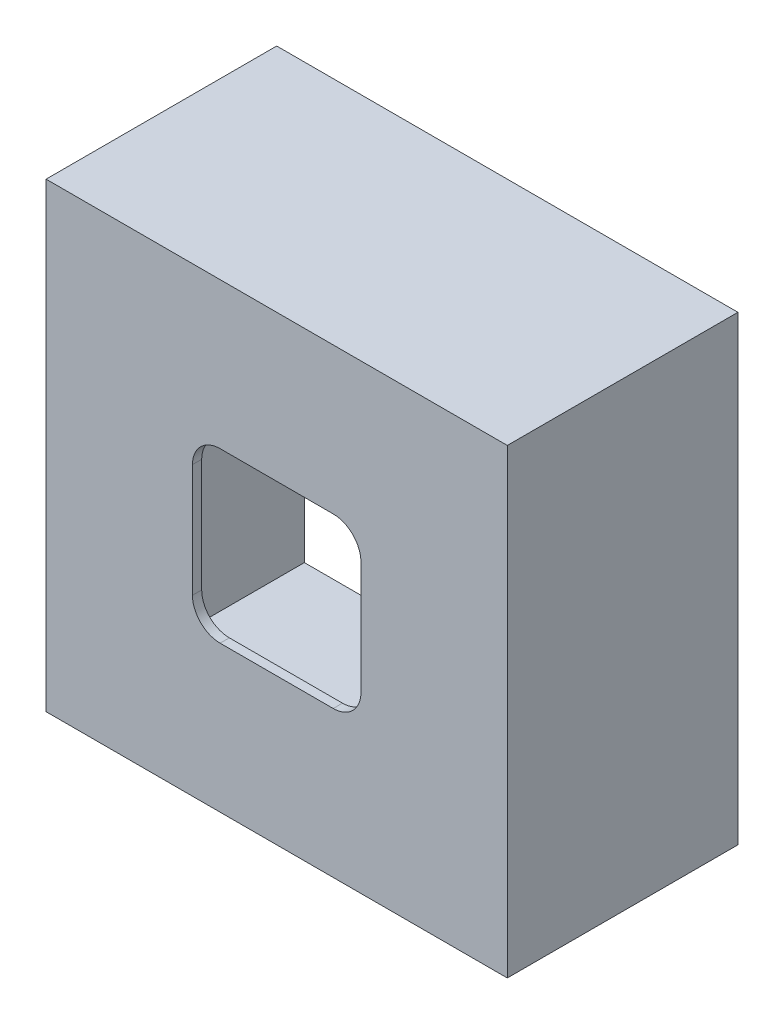
ISO-10303-21;
HEADER;
FILE_DESCRIPTION(('STEP AP214'),'2;1');
FILE_NAME('part.step','',(''),(''),'','','');
FILE_SCHEMA(('AUTOMOTIVE_DESIGN { 1 0 10303 214 1 1 1 1 }'));
ENDSEC;
DATA;
#1=APPLICATION_CONTEXT('core data for automotive mechanical design processes');
#2=APPLICATION_PROTOCOL_DEFINITION('international standard','automotive_design',2000,#1);
#3=PRODUCT_CONTEXT('',#1,'mechanical');
#4=PRODUCT('Part','Part','',(#3));
#5=PRODUCT_RELATED_PRODUCT_CATEGORY('part','',(#4));
#6=PRODUCT_DEFINITION_FORMATION('','',#4);
#7=PRODUCT_DEFINITION_CONTEXT('part definition',#1,'design');
#8=PRODUCT_DEFINITION('design','',#6,#7);
#9=PRODUCT_DEFINITION_SHAPE('','',#8);
#10=(LENGTH_UNIT() NAMED_UNIT(*) SI_UNIT(.MILLI.,.METRE.));
#11=(NAMED_UNIT(*) PLANE_ANGLE_UNIT() SI_UNIT($,.RADIAN.));
#12=(NAMED_UNIT(*) SI_UNIT($,.STERADIAN.) SOLID_ANGLE_UNIT());
#13=UNCERTAINTY_MEASURE_WITH_UNIT(LENGTH_MEASURE(1.E-05),#10,'distance_accuracy_value','');
#14=(GEOMETRIC_REPRESENTATION_CONTEXT(3) GLOBAL_UNCERTAINTY_ASSIGNED_CONTEXT((#13)) GLOBAL_UNIT_ASSIGNED_CONTEXT((#10,
#11,#12)) REPRESENTATION_CONTEXT('',''));
#15=CARTESIAN_POINT('',(0.,0.,0.));
#16=DIRECTION('',(0.,0.,1.));
#17=DIRECTION('',(1.,0.,0.));
#18=AXIS2_PLACEMENT_3D('',#15,#16,#17);
#19=CARTESIAN_POINT('',(50.,-50.0000000000001,-143.42135623731));
#20=DIRECTION('',(0.,-1.,0.));
#21=DIRECTION('',(0.,0.,-1.));
#22=AXIS2_PLACEMENT_3D('',#19,#20,#21);
#23=PLANE('',#22);
#24=DIRECTION('',(0.,0.,1.));
#25=VECTOR('',#24,1.);
#26=CARTESIAN_POINT('',(-50.,-50.0000000000001,-143.42135623731));
#27=LINE('',#26,#25);
#28=CARTESIAN_POINT('',(-50.,-50.0000000000001,-50.));
#29=VERTEX_POINT('',#28);
#30=CARTESIAN_POINT('',(-50.,-50.0000000000001,0.));
#31=VERTEX_POINT('',#30);
#32=EDGE_CURVE('E269',#29,#31,#27,.T.);
#33=ORIENTED_EDGE('',*,*,#32,.F.);
#34=DIRECTION('',(-1.,0.,0.));
#35=VECTOR('',#34,1.);
#36=CARTESIAN_POINT('',(50.,-50.,-50.));
#37=LINE('',#36,#35);
#38=CARTESIAN_POINT('',(50.,-50.,-50.));
#39=VERTEX_POINT('',#38);
#40=EDGE_CURVE('E191',#39,#29,#37,.T.);
#41=ORIENTED_EDGE('',*,*,#40,.F.);
#42=DIRECTION('',(0.,0.,1.));
#43=VECTOR('',#42,1.);
#44=CARTESIAN_POINT('',(50.,-50.0000000000001,-143.42135623731));
#45=LINE('',#44,#43);
#46=CARTESIAN_POINT('',(50.,-50.0000000000001,0.));
#47=VERTEX_POINT('',#46);
#48=EDGE_CURVE('E274',#39,#47,#45,.T.);
#49=ORIENTED_EDGE('',*,*,#48,.T.);
#50=DIRECTION('',(1.,0.,0.));
#51=VECTOR('',#50,1.);
#52=CARTESIAN_POINT('',(50.,-50.0000000000001,0.));
#53=LINE('',#52,#51);
#54=EDGE_CURVE('E260',#31,#47,#53,.T.);
#55=ORIENTED_EDGE('',*,*,#54,.F.);
#56=EDGE_LOOP('',(#33,#41,#49,#55));
#57=FACE_BOUND('',#56,.T.);
#58=ADVANCED_FACE('F35',(#57),#23,.T.);
#59=CARTESIAN_POINT('',(50.,50.,-143.42135623731));
#60=DIRECTION('',(1.,0.,0.));
#61=DIRECTION('',(0.,0.,-1.));
#62=AXIS2_PLACEMENT_3D('',#59,#60,#61);
#63=PLANE('',#62);
#64=ORIENTED_EDGE('',*,*,#48,.F.);
#65=DIRECTION('',(0.,-1.,0.));
#66=VECTOR('',#65,1.);
#67=CARTESIAN_POINT('',(50.,50.,-50.));
#68=LINE('',#67,#66);
#69=CARTESIAN_POINT('',(50.,50.,-50.));
#70=VERTEX_POINT('',#69);
#71=EDGE_CURVE('E165',#70,#39,#68,.T.);
#72=ORIENTED_EDGE('',*,*,#71,.F.);
#73=DIRECTION('',(0.,0.,1.));
#74=VECTOR('',#73,1.);
#75=CARTESIAN_POINT('',(50.,50.,-143.42135623731));
#76=LINE('',#75,#74);
#77=CARTESIAN_POINT('',(50.,50.,0.));
#78=VERTEX_POINT('',#77);
#79=EDGE_CURVE('E272',#70,#78,#76,.T.);
#80=ORIENTED_EDGE('',*,*,#79,.T.);
#81=DIRECTION('',(0.,1.,0.));
#82=VECTOR('',#81,1.);
#83=CARTESIAN_POINT('',(50.,50.,0.));
#84=LINE('',#83,#82);
#85=EDGE_CURVE('E263',#47,#78,#84,.T.);
#86=ORIENTED_EDGE('',*,*,#85,.F.);
#87=EDGE_LOOP('',(#64,#72,#80,#86));
#88=FACE_BOUND('',#87,.T.);
#89=ADVANCED_FACE('F291',(#88),#63,.T.);
#90=CARTESIAN_POINT('',(50.,50.,-143.42135623731));
#91=DIRECTION('',(0.,1.,0.));
#92=DIRECTION('',(0.,0.,1.));
#93=AXIS2_PLACEMENT_3D('',#90,#91,#92);
#94=PLANE('',#93);
#95=ORIENTED_EDGE('',*,*,#79,.F.);
#96=DIRECTION('',(1.,0.,0.));
#97=VECTOR('',#96,1.);
#98=CARTESIAN_POINT('',(50.,50.,-50.));
#99=LINE('',#98,#97);
#100=CARTESIAN_POINT('',(-50.,50.,-50.));
#101=VERTEX_POINT('',#100);
#102=EDGE_CURVE('E197',#101,#70,#99,.T.);
#103=ORIENTED_EDGE('',*,*,#102,.F.);
#104=DIRECTION('',(0.,0.,1.));
#105=VECTOR('',#104,1.);
#106=CARTESIAN_POINT('',(-50.,50.,-143.42135623731));
#107=LINE('',#106,#105);
#108=CARTESIAN_POINT('',(-50.,50.,0.));
#109=VERTEX_POINT('',#108);
#110=EDGE_CURVE('E270',#101,#109,#107,.T.);
#111=ORIENTED_EDGE('',*,*,#110,.T.);
#112=DIRECTION('',(-1.,0.,0.));
#113=VECTOR('',#112,1.);
#114=CARTESIAN_POINT('',(50.,50.,0.));
#115=LINE('',#114,#113);
#116=EDGE_CURVE('E266',#78,#109,#115,.T.);
#117=ORIENTED_EDGE('',*,*,#116,.F.);
#118=EDGE_LOOP('',(#95,#103,#111,#117));
#119=FACE_BOUND('',#118,.T.);
#120=ADVANCED_FACE('F286',(#119),#94,.T.);
#121=CARTESIAN_POINT('',(-50.,50.,-143.42135623731));
#122=DIRECTION('',(-1.,0.,0.));
#123=DIRECTION('',(0.,0.,1.));
#124=AXIS2_PLACEMENT_3D('',#121,#122,#123);
#125=PLANE('',#124);
#126=ORIENTED_EDGE('',*,*,#110,.F.);
#127=DIRECTION('',(0.,1.,0.));
#128=VECTOR('',#127,1.);
#129=CARTESIAN_POINT('',(-50.,50.,-50.));
#130=LINE('',#129,#128);
#131=EDGE_CURVE('E194',#29,#101,#130,.T.);
#132=ORIENTED_EDGE('',*,*,#131,.F.);
#133=ORIENTED_EDGE('',*,*,#32,.T.);
#134=DIRECTION('',(0.,-1.,0.));
#135=VECTOR('',#134,1.);
#136=CARTESIAN_POINT('',(-50.,50.,0.));
#137=LINE('',#136,#135);
#138=EDGE_CURVE('E244',#109,#31,#137,.T.);
#139=ORIENTED_EDGE('',*,*,#138,.F.);
#140=EDGE_LOOP('',(#126,#132,#133,#139));
#141=FACE_BOUND('',#140,.T.);
#142=ADVANCED_FACE('F37',(#141),#125,.T.);
#143=CARTESIAN_POINT('',(0.,0.,0.));
#144=DIRECTION('',(0.,0.,-1.));
#145=DIRECTION('',(-1.,0.,0.));
#146=AXIS2_PLACEMENT_3D('',#143,#144,#145);
#147=PLANE('',#146);
#148=DIRECTION('',(0.,-1.,0.));
#149=VECTOR('',#148,1.);
#150=CARTESIAN_POINT('',(-18.2634559672906,12.2634559672906,0.));
#151=LINE('',#150,#149);
#152=CARTESIAN_POINT('',(-18.2634559672906,12.2634559672906,0.));
#153=VERTEX_POINT('',#152);
#154=CARTESIAN_POINT('',(-18.2634559672906,-12.2634559672906,0.));
#155=VERTEX_POINT('',#154);
#156=EDGE_CURVE('E220',#153,#155,#151,.T.);
#157=ORIENTED_EDGE('',*,*,#156,.F.);
#158=CARTESIAN_POINT('',(-12.2634559672906,12.2634559672906,0.));
#159=DIRECTION('',(0.,0.,1.));
#160=DIRECTION('',(1.,0.,0.));
#161=AXIS2_PLACEMENT_3D('',#158,#159,#160);
#162=CIRCLE('',#161,6.00000000000001);
#163=CARTESIAN_POINT('',(-12.2634559672906,18.2634559672906,0.));
#164=VERTEX_POINT('',#163);
#165=EDGE_CURVE('E199',#164,#153,#162,.T.);
#166=ORIENTED_EDGE('',*,*,#165,.F.);
#167=DIRECTION('',(-1.,0.,0.));
#168=VECTOR('',#167,1.);
#169=CARTESIAN_POINT('',(12.2634559672906,18.2634559672906,0.));
#170=LINE('',#169,#168);
#171=CARTESIAN_POINT('',(12.2634559672906,18.2634559672906,0.));
#172=VERTEX_POINT('',#171);
#173=EDGE_CURVE('E238',#172,#164,#170,.T.);
#174=ORIENTED_EDGE('',*,*,#173,.F.);
#175=CARTESIAN_POINT('',(12.2634559672906,12.2634559672906,0.));
#176=DIRECTION('',(0.,0.,1.));
#177=DIRECTION('',(1.,0.,0.));
#178=AXIS2_PLACEMENT_3D('',#175,#176,#177);
#179=CIRCLE('',#178,6.00000000000001);
#180=CARTESIAN_POINT('',(18.2634559672906,12.2634559672906,0.));
#181=VERTEX_POINT('',#180);
#182=EDGE_CURVE('E235',#181,#172,#179,.T.);
#183=ORIENTED_EDGE('',*,*,#182,.F.);
#184=DIRECTION('',(0.,1.,0.));
#185=VECTOR('',#184,1.);
#186=CARTESIAN_POINT('',(18.2634559672906,-12.2634559672906,0.));
#187=LINE('',#186,#185);
#188=CARTESIAN_POINT('',(18.2634559672906,-12.2634559672906,0.));
#189=VERTEX_POINT('',#188);
#190=EDGE_CURVE('E232',#189,#181,#187,.T.);
#191=ORIENTED_EDGE('',*,*,#190,.F.);
#192=CARTESIAN_POINT('',(12.2634559672906,-12.2634559672906,0.));
#193=DIRECTION('',(0.,0.,1.));
#194=DIRECTION('',(1.,0.,0.));
#195=AXIS2_PLACEMENT_3D('',#192,#193,#194);
#196=CIRCLE('',#195,6.);
#197=CARTESIAN_POINT('',(12.2634559672906,-18.2634559672906,0.));
#198=VERTEX_POINT('',#197);
#199=EDGE_CURVE('E229',#198,#189,#196,.T.);
#200=ORIENTED_EDGE('',*,*,#199,.F.);
#201=DIRECTION('',(1.,0.,0.));
#202=VECTOR('',#201,1.);
#203=CARTESIAN_POINT('',(-12.2634559672906,-18.2634559672906,0.));
#204=LINE('',#203,#202);
#205=CARTESIAN_POINT('',(-12.2634559672906,-18.2634559672906,0.));
#206=VERTEX_POINT('',#205);
#207=EDGE_CURVE('E226',#206,#198,#204,.T.);
#208=ORIENTED_EDGE('',*,*,#207,.F.);
#209=CARTESIAN_POINT('',(-12.2634559672906,-12.2634559672906,0.));
#210=DIRECTION('',(0.,0.,1.));
#211=DIRECTION('',(1.,0.,0.));
#212=AXIS2_PLACEMENT_3D('',#209,#210,#211);
#213=CIRCLE('',#212,6.);
#214=EDGE_CURVE('E223',#155,#206,#213,.T.);
#215=ORIENTED_EDGE('',*,*,#214,.F.);
#216=EDGE_LOOP('',(#157,#166,#174,#183,#191,#200,#208,#215));
#217=FACE_BOUND('',#216,.T.);
#218=ORIENTED_EDGE('',*,*,#138,.T.);
#219=ORIENTED_EDGE('',*,*,#54,.T.);
#220=ORIENTED_EDGE('',*,*,#85,.T.);
#221=ORIENTED_EDGE('',*,*,#116,.T.);
#222=EDGE_LOOP('',(#218,#219,#220,#221));
#223=FACE_BOUND('',#222,.T.);
#224=ADVANCED_FACE('F283',(#217,#223),#147,.F.);
#225=CARTESIAN_POINT('',(-18.2634559672906,12.2634559672906,-143.42135623731));
#226=DIRECTION('',(-1.,0.,0.));
#227=DIRECTION('',(0.,-1.,0.));
#228=AXIS2_PLACEMENT_3D('',#225,#226,#227);
#229=PLANE('',#228);
#230=DIRECTION('',(0.,0.,1.));
#231=VECTOR('',#230,1.);
#232=CARTESIAN_POINT('',(-18.2634559672906,-12.2634559672906,-143.42135623731));
#233=LINE('',#232,#231);
#234=CARTESIAN_POINT('',(-18.2634559672906,-12.2634559672906,-2.));
#235=VERTEX_POINT('',#234);
#236=EDGE_CURVE('E255',#235,#155,#233,.T.);
#237=ORIENTED_EDGE('',*,*,#236,.F.);
#238=DIRECTION('',(0.,1.,0.));
#239=VECTOR('',#238,1.);
#240=CARTESIAN_POINT('',(-18.2634559672906,12.2634559672906,-2.));
#241=LINE('',#240,#239);
#242=CARTESIAN_POINT('',(-18.2634559672906,12.2634559672906,-2.));
#243=VERTEX_POINT('',#242);
#244=EDGE_CURVE('E39',#235,#243,#241,.T.);
#245=ORIENTED_EDGE('',*,*,#244,.T.);
#246=DIRECTION('',(0.,0.,1.));
#247=VECTOR('',#246,1.);
#248=CARTESIAN_POINT('',(-18.2634559672906,12.2634559672906,-143.42135623731));
#249=LINE('',#248,#247);
#250=EDGE_CURVE('E241',#243,#153,#249,.T.);
#251=ORIENTED_EDGE('',*,*,#250,.T.);
#252=ORIENTED_EDGE('',*,*,#156,.T.);
#253=EDGE_LOOP('',(#237,#245,#251,#252));
#254=FACE_BOUND('',#253,.T.);
#255=ADVANCED_FACE('F302',(#254),#229,.F.);
#256=CARTESIAN_POINT('',(-12.2634559672906,-12.2634559672906,-143.42135623731));
#257=DIRECTION('',(0.,0.,1.));
#258=DIRECTION('',(1.,0.,0.));
#259=AXIS2_PLACEMENT_3D('',#256,#257,#258);
#260=CYLINDRICAL_SURFACE('',#259,6.);
#261=DIRECTION('',(0.,0.,1.));
#262=VECTOR('',#261,1.);
#263=CARTESIAN_POINT('',(-12.2634559672906,-18.2634559672906,-143.42135623731));
#264=LINE('',#263,#262);
#265=CARTESIAN_POINT('',(-12.2634559672906,-18.2634559672906,-2.));
#266=VERTEX_POINT('',#265);
#267=EDGE_CURVE('E253',#266,#206,#264,.T.);
#268=ORIENTED_EDGE('',*,*,#267,.F.);
#269=CARTESIAN_POINT('',(-12.2634559672906,-12.2634559672906,-2.));
#270=DIRECTION('',(0.,0.,1.));
#271=DIRECTION('',(1.,0.,0.));
#272=AXIS2_PLACEMENT_3D('',#269,#270,#271);
#273=CIRCLE('',#272,6.);
#274=EDGE_CURVE('E11',#266,#235,#273,.F.);
#275=ORIENTED_EDGE('',*,*,#274,.T.);
#276=ORIENTED_EDGE('',*,*,#236,.T.);
#277=ORIENTED_EDGE('',*,*,#214,.T.);
#278=EDGE_LOOP('',(#268,#275,#276,#277));
#279=FACE_BOUND('',#278,.T.);
#280=ADVANCED_FACE('F312',(#279),#260,.F.);
#281=CARTESIAN_POINT('',(-12.2634559672906,-18.2634559672906,-143.42135623731));
#282=DIRECTION('',(0.,-1.,0.));
#283=DIRECTION('',(1.,0.,0.));
#284=AXIS2_PLACEMENT_3D('',#281,#282,#283);
#285=PLANE('',#284);
#286=DIRECTION('',(0.,0.,1.));
#287=VECTOR('',#286,1.);
#288=CARTESIAN_POINT('',(12.2634559672906,-18.2634559672906,-143.42135623731));
#289=LINE('',#288,#287);
#290=CARTESIAN_POINT('',(12.2634559672906,-18.2634559672906,-2.));
#291=VERTEX_POINT('',#290);
#292=EDGE_CURVE('E251',#291,#198,#289,.T.);
#293=ORIENTED_EDGE('',*,*,#292,.F.);
#294=DIRECTION('',(-1.,0.,0.));
#295=VECTOR('',#294,1.);
#296=CARTESIAN_POINT('',(-12.2634559672906,-18.2634559672906,-2.));
#297=LINE('',#296,#295);
#298=EDGE_CURVE('E44',#291,#266,#297,.T.);
#299=ORIENTED_EDGE('',*,*,#298,.T.);
#300=ORIENTED_EDGE('',*,*,#267,.T.);
#301=ORIENTED_EDGE('',*,*,#207,.T.);
#302=EDGE_LOOP('',(#293,#299,#300,#301));
#303=FACE_BOUND('',#302,.T.);
#304=ADVANCED_FACE('F316',(#303),#285,.F.);
#305=CARTESIAN_POINT('',(12.2634559672906,-12.2634559672906,-143.42135623731));
#306=DIRECTION('',(0.,0.,1.));
#307=DIRECTION('',(1.,0.,0.));
#308=AXIS2_PLACEMENT_3D('',#305,#306,#307);
#309=CYLINDRICAL_SURFACE('',#308,6.);
#310=DIRECTION('',(0.,0.,1.));
#311=VECTOR('',#310,1.);
#312=CARTESIAN_POINT('',(18.2634559672906,-12.2634559672906,-143.42135623731));
#313=LINE('',#312,#311);
#314=CARTESIAN_POINT('',(18.2634559672906,-12.2634559672906,-2.));
#315=VERTEX_POINT('',#314);
#316=EDGE_CURVE('E249',#315,#189,#313,.T.);
#317=ORIENTED_EDGE('',*,*,#316,.F.);
#318=CARTESIAN_POINT('',(12.2634559672906,-12.2634559672906,-2.));
#319=DIRECTION('',(0.,0.,1.));
#320=DIRECTION('',(1.,0.,0.));
#321=AXIS2_PLACEMENT_3D('',#318,#319,#320);
#322=CIRCLE('',#321,6.);
#323=EDGE_CURVE('E203',#315,#291,#322,.F.);
#324=ORIENTED_EDGE('',*,*,#323,.T.);
#325=ORIENTED_EDGE('',*,*,#292,.T.);
#326=ORIENTED_EDGE('',*,*,#199,.T.);
#327=EDGE_LOOP('',(#317,#324,#325,#326));
#328=FACE_BOUND('',#327,.T.);
#329=ADVANCED_FACE('F320',(#328),#309,.F.);
#330=CARTESIAN_POINT('',(18.2634559672906,-12.2634559672906,-143.42135623731));
#331=DIRECTION('',(1.,0.,0.));
#332=DIRECTION('',(0.,1.,0.));
#333=AXIS2_PLACEMENT_3D('',#330,#331,#332);
#334=PLANE('',#333);
#335=DIRECTION('',(0.,0.,1.));
#336=VECTOR('',#335,1.);
#337=CARTESIAN_POINT('',(18.2634559672906,12.2634559672906,-143.42135623731));
#338=LINE('',#337,#336);
#339=CARTESIAN_POINT('',(18.2634559672906,12.2634559672906,-2.));
#340=VERTEX_POINT('',#339);
#341=EDGE_CURVE('E247',#340,#181,#338,.T.);
#342=ORIENTED_EDGE('',*,*,#341,.F.);
#343=DIRECTION('',(0.,-1.,0.));
#344=VECTOR('',#343,1.);
#345=CARTESIAN_POINT('',(18.2634559672906,-12.2634559672906,-2.));
#346=LINE('',#345,#344);
#347=EDGE_CURVE('E206',#340,#315,#346,.T.);
#348=ORIENTED_EDGE('',*,*,#347,.T.);
#349=ORIENTED_EDGE('',*,*,#316,.T.);
#350=ORIENTED_EDGE('',*,*,#190,.T.);
#351=EDGE_LOOP('',(#342,#348,#349,#350));
#352=FACE_BOUND('',#351,.T.);
#353=ADVANCED_FACE('F324',(#352),#334,.F.);
#354=CARTESIAN_POINT('',(12.2634559672906,12.2634559672906,-143.42135623731));
#355=DIRECTION('',(0.,0.,1.));
#356=DIRECTION('',(1.,0.,0.));
#357=AXIS2_PLACEMENT_3D('',#354,#355,#356);
#358=CYLINDRICAL_SURFACE('',#357,6.00000000000001);
#359=DIRECTION('',(0.,0.,1.));
#360=VECTOR('',#359,1.);
#361=CARTESIAN_POINT('',(12.2634559672906,18.2634559672906,-143.42135623731));
#362=LINE('',#361,#360);
#363=CARTESIAN_POINT('',(12.2634559672906,18.2634559672906,-2.));
#364=VERTEX_POINT('',#363);
#365=EDGE_CURVE('E245',#364,#172,#362,.T.);
#366=ORIENTED_EDGE('',*,*,#365,.F.);
#367=CARTESIAN_POINT('',(12.2634559672906,12.2634559672906,-2.));
#368=DIRECTION('',(0.,0.,1.));
#369=DIRECTION('',(1.,0.,0.));
#370=AXIS2_PLACEMENT_3D('',#367,#368,#369);
#371=CIRCLE('',#370,6.00000000000001);
#372=EDGE_CURVE('E209',#364,#340,#371,.F.);
#373=ORIENTED_EDGE('',*,*,#372,.T.);
#374=ORIENTED_EDGE('',*,*,#341,.T.);
#375=ORIENTED_EDGE('',*,*,#182,.T.);
#376=EDGE_LOOP('',(#366,#373,#374,#375));
#377=FACE_BOUND('',#376,.T.);
#378=ADVANCED_FACE('F328',(#377),#358,.F.);
#379=CARTESIAN_POINT('',(12.2634559672906,18.2634559672906,-143.42135623731));
#380=DIRECTION('',(0.,1.,0.));
#381=DIRECTION('',(0.,0.,1.));
#382=AXIS2_PLACEMENT_3D('',#379,#380,#381);
#383=PLANE('',#382);
#384=DIRECTION('',(0.,0.,1.));
#385=VECTOR('',#384,1.);
#386=CARTESIAN_POINT('',(-12.2634559672906,18.2634559672906,-143.42135623731));
#387=LINE('',#386,#385);
#388=CARTESIAN_POINT('',(-12.2634559672906,18.2634559672906,-2.));
#389=VERTEX_POINT('',#388);
#390=EDGE_CURVE('E242',#389,#164,#387,.T.);
#391=ORIENTED_EDGE('',*,*,#390,.F.);
#392=DIRECTION('',(1.,0.,0.));
#393=VECTOR('',#392,1.);
#394=CARTESIAN_POINT('',(12.2634559672906,18.2634559672906,-2.));
#395=LINE('',#394,#393);
#396=EDGE_CURVE('E212',#389,#364,#395,.T.);
#397=ORIENTED_EDGE('',*,*,#396,.T.);
#398=ORIENTED_EDGE('',*,*,#365,.T.);
#399=ORIENTED_EDGE('',*,*,#173,.T.);
#400=EDGE_LOOP('',(#391,#397,#398,#399));
#401=FACE_BOUND('',#400,.T.);
#402=ADVANCED_FACE('F308',(#401),#383,.F.);
#403=CARTESIAN_POINT('',(-12.2634559672906,12.2634559672906,-143.42135623731));
#404=DIRECTION('',(0.,0.,1.));
#405=DIRECTION('',(1.,0.,0.));
#406=AXIS2_PLACEMENT_3D('',#403,#404,#405);
#407=CYLINDRICAL_SURFACE('',#406,6.00000000000001);
#408=ORIENTED_EDGE('',*,*,#250,.F.);
#409=CARTESIAN_POINT('',(-12.2634559672906,12.2634559672906,-2.));
#410=DIRECTION('',(0.,0.,1.));
#411=DIRECTION('',(1.,0.,0.));
#412=AXIS2_PLACEMENT_3D('',#409,#410,#411);
#413=CIRCLE('',#412,6.00000000000001);
#414=EDGE_CURVE('E215',#243,#389,#413,.F.);
#415=ORIENTED_EDGE('',*,*,#414,.T.);
#416=ORIENTED_EDGE('',*,*,#390,.T.);
#417=ORIENTED_EDGE('',*,*,#165,.T.);
#418=EDGE_LOOP('',(#408,#415,#416,#417));
#419=FACE_BOUND('',#418,.T.);
#420=ADVANCED_FACE('F304',(#419),#407,.F.);
#421=CARTESIAN_POINT('',(0.,0.,-2.));
#422=DIRECTION('',(0.,0.,1.));
#423=DIRECTION('',(1.,0.,0.));
#424=AXIS2_PLACEMENT_3D('',#421,#422,#423);
#425=PLANE('',#424);
#426=DIRECTION('',(1.,0.,0.));
#427=VECTOR('',#426,1.);
#428=CARTESIAN_POINT('',(44.,44.,-2.));
#429=LINE('',#428,#427);
#430=CARTESIAN_POINT('',(-44.,44.,-2.));
#431=VERTEX_POINT('',#430);
#432=CARTESIAN_POINT('',(44.,44.,-2.));
#433=VERTEX_POINT('',#432);
#434=EDGE_CURVE('E158',#431,#433,#429,.T.);
#435=ORIENTED_EDGE('',*,*,#434,.T.);
#436=DIRECTION('',(0.,-1.,0.));
#437=VECTOR('',#436,1.);
#438=CARTESIAN_POINT('',(44.,44.,-2.));
#439=LINE('',#438,#437);
#440=CARTESIAN_POINT('',(44.,-44.,-2.));
#441=VERTEX_POINT('',#440);
#442=EDGE_CURVE('E177',#433,#441,#439,.T.);
#443=ORIENTED_EDGE('',*,*,#442,.T.);
#444=DIRECTION('',(-1.,0.,0.));
#445=VECTOR('',#444,1.);
#446=CARTESIAN_POINT('',(44.,-44.,-2.));
#447=LINE('',#446,#445);
#448=CARTESIAN_POINT('',(-44.,-44.,-2.));
#449=VERTEX_POINT('',#448);
#450=EDGE_CURVE('E164',#441,#449,#447,.T.);
#451=ORIENTED_EDGE('',*,*,#450,.T.);
#452=DIRECTION('',(0.,1.,0.));
#453=VECTOR('',#452,1.);
#454=CARTESIAN_POINT('',(-44.,44.,-2.));
#455=LINE('',#454,#453);
#456=EDGE_CURVE('E180',#449,#431,#455,.T.);
#457=ORIENTED_EDGE('',*,*,#456,.T.);
#458=EDGE_LOOP('',(#435,#443,#451,#457));
#459=FACE_BOUND('',#458,.T.);
#460=ORIENTED_EDGE('',*,*,#244,.F.);
#461=ORIENTED_EDGE('',*,*,#274,.F.);
#462=ORIENTED_EDGE('',*,*,#298,.F.);
#463=ORIENTED_EDGE('',*,*,#323,.F.);
#464=ORIENTED_EDGE('',*,*,#347,.F.);
#465=ORIENTED_EDGE('',*,*,#372,.F.);
#466=ORIENTED_EDGE('',*,*,#396,.F.);
#467=ORIENTED_EDGE('',*,*,#414,.F.);
#468=EDGE_LOOP('',(#460,#461,#462,#463,#464,#465,#466,#467));
#469=FACE_BOUND('',#468,.T.);
#470=ADVANCED_FACE('F307',(#459,#469),#425,.F.);
#471=CARTESIAN_POINT('',(0.,0.,-50.));
#472=DIRECTION('',(0.,0.,-1.));
#473=DIRECTION('',(-1.,0.,0.));
#474=AXIS2_PLACEMENT_3D('',#471,#472,#473);
#475=PLANE('',#474);
#476=ORIENTED_EDGE('',*,*,#71,.T.);
#477=ORIENTED_EDGE('',*,*,#40,.T.);
#478=ORIENTED_EDGE('',*,*,#131,.T.);
#479=ORIENTED_EDGE('',*,*,#102,.T.);
#480=EDGE_LOOP('',(#476,#477,#478,#479));
#481=FACE_BOUND('',#480,.T.);
#482=DIRECTION('',(-1.,0.,0.));
#483=VECTOR('',#482,1.);
#484=CARTESIAN_POINT('',(44.,-44.,-50.));
#485=LINE('',#484,#483);
#486=CARTESIAN_POINT('',(44.,-44.,-50.));
#487=VERTEX_POINT('',#486);
#488=CARTESIAN_POINT('',(-44.,-44.,-50.));
#489=VERTEX_POINT('',#488);
#490=EDGE_CURVE('E157',#487,#489,#485,.T.);
#491=ORIENTED_EDGE('',*,*,#490,.F.);
#492=DIRECTION('',(0.,-1.,0.));
#493=VECTOR('',#492,1.);
#494=CARTESIAN_POINT('',(44.,44.,-50.));
#495=LINE('',#494,#493);
#496=CARTESIAN_POINT('',(44.,44.,-50.));
#497=VERTEX_POINT('',#496);
#498=EDGE_CURVE('E149',#497,#487,#495,.T.);
#499=ORIENTED_EDGE('',*,*,#498,.F.);
#500=DIRECTION('',(1.,0.,0.));
#501=VECTOR('',#500,1.);
#502=CARTESIAN_POINT('',(44.,44.,-50.));
#503=LINE('',#502,#501);
#504=CARTESIAN_POINT('',(-44.,44.,-50.));
#505=VERTEX_POINT('',#504);
#506=EDGE_CURVE('E173',#505,#497,#503,.T.);
#507=ORIENTED_EDGE('',*,*,#506,.F.);
#508=DIRECTION('',(0.,1.,0.));
#509=VECTOR('',#508,1.);
#510=CARTESIAN_POINT('',(-44.,44.,-50.));
#511=LINE('',#510,#509);
#512=EDGE_CURVE('E171',#489,#505,#511,.T.);
#513=ORIENTED_EDGE('',*,*,#512,.F.);
#514=EDGE_LOOP('',(#491,#499,#507,#513));
#515=FACE_BOUND('',#514,.T.);
#516=ADVANCED_FACE('F169',(#481,#515),#475,.T.);
#517=CARTESIAN_POINT('',(44.,44.,-50.));
#518=DIRECTION('',(-1.,0.,0.));
#519=DIRECTION('',(0.,0.,1.));
#520=AXIS2_PLACEMENT_3D('',#517,#518,#519);
#521=PLANE('',#520);
#522=ORIENTED_EDGE('',*,*,#442,.F.);
#523=DIRECTION('',(0.,0.,1.));
#524=VECTOR('',#523,1.);
#525=CARTESIAN_POINT('',(44.,44.,-50.));
#526=LINE('',#525,#524);
#527=EDGE_CURVE('E52',#497,#433,#526,.T.);
#528=ORIENTED_EDGE('',*,*,#527,.F.);
#529=ORIENTED_EDGE('',*,*,#498,.T.);
#530=DIRECTION('',(0.,0.,1.));
#531=VECTOR('',#530,1.);
#532=CARTESIAN_POINT('',(44.,-44.,-50.));
#533=LINE('',#532,#531);
#534=EDGE_CURVE('E152',#487,#441,#533,.T.);
#535=ORIENTED_EDGE('',*,*,#534,.T.);
#536=EDGE_LOOP('',(#522,#528,#529,#535));
#537=FACE_BOUND('',#536,.T.);
#538=ADVANCED_FACE('F151',(#537),#521,.T.);
#539=CARTESIAN_POINT('',(44.,-44.,-50.));
#540=DIRECTION('',(0.,1.,0.));
#541=DIRECTION('',(-1.,0.,0.));
#542=AXIS2_PLACEMENT_3D('',#539,#540,#541);
#543=PLANE('',#542);
#544=ORIENTED_EDGE('',*,*,#450,.F.);
#545=ORIENTED_EDGE('',*,*,#534,.F.);
#546=ORIENTED_EDGE('',*,*,#490,.T.);
#547=DIRECTION('',(0.,0.,1.));
#548=VECTOR('',#547,1.);
#549=CARTESIAN_POINT('',(-44.,-44.,-50.));
#550=LINE('',#549,#548);
#551=EDGE_CURVE('E166',#489,#449,#550,.T.);
#552=ORIENTED_EDGE('',*,*,#551,.T.);
#553=EDGE_LOOP('',(#544,#545,#546,#552));
#554=FACE_BOUND('',#553,.T.);
#555=ADVANCED_FACE('F161',(#554),#543,.T.);
#556=CARTESIAN_POINT('',(-44.,44.,-50.));
#557=DIRECTION('',(1.,0.,0.));
#558=DIRECTION('',(0.,0.,-1.));
#559=AXIS2_PLACEMENT_3D('',#556,#557,#558);
#560=PLANE('',#559);
#561=ORIENTED_EDGE('',*,*,#456,.F.);
#562=ORIENTED_EDGE('',*,*,#551,.F.);
#563=ORIENTED_EDGE('',*,*,#512,.T.);
#564=DIRECTION('',(0.,0.,1.));
#565=VECTOR('',#564,1.);
#566=CARTESIAN_POINT('',(-44.,44.,-50.));
#567=LINE('',#566,#565);
#568=EDGE_CURVE('E186',#505,#431,#567,.T.);
#569=ORIENTED_EDGE('',*,*,#568,.T.);
#570=EDGE_LOOP('',(#561,#562,#563,#569));
#571=FACE_BOUND('',#570,.T.);
#572=ADVANCED_FACE('F345',(#571),#560,.T.);
#573=CARTESIAN_POINT('',(44.,44.,-50.));
#574=DIRECTION('',(0.,-1.,0.));
#575=DIRECTION('',(1.,0.,0.));
#576=AXIS2_PLACEMENT_3D('',#573,#574,#575);
#577=PLANE('',#576);
#578=ORIENTED_EDGE('',*,*,#434,.F.);
#579=ORIENTED_EDGE('',*,*,#568,.F.);
#580=ORIENTED_EDGE('',*,*,#506,.T.);
#581=ORIENTED_EDGE('',*,*,#527,.T.);
#582=EDGE_LOOP('',(#578,#579,#580,#581));
#583=FACE_BOUND('',#582,.T.);
#584=ADVANCED_FACE('F348',(#583),#577,.T.);
#585=CLOSED_SHELL('',(#58,#89,#120,#142,#224,#255,#280,#304,#329,#353,#378,#402,#420,#470,#516,
#538,#555,#572,#584));
#586=MANIFOLD_SOLID_BREP('B2',#585);
#587=ADVANCED_BREP_SHAPE_REPRESENTATION('',(#18,#586),#14);
#588=SHAPE_DEFINITION_REPRESENTATION(#9,#587);
ENDSEC;
END-ISO-10303-21;
